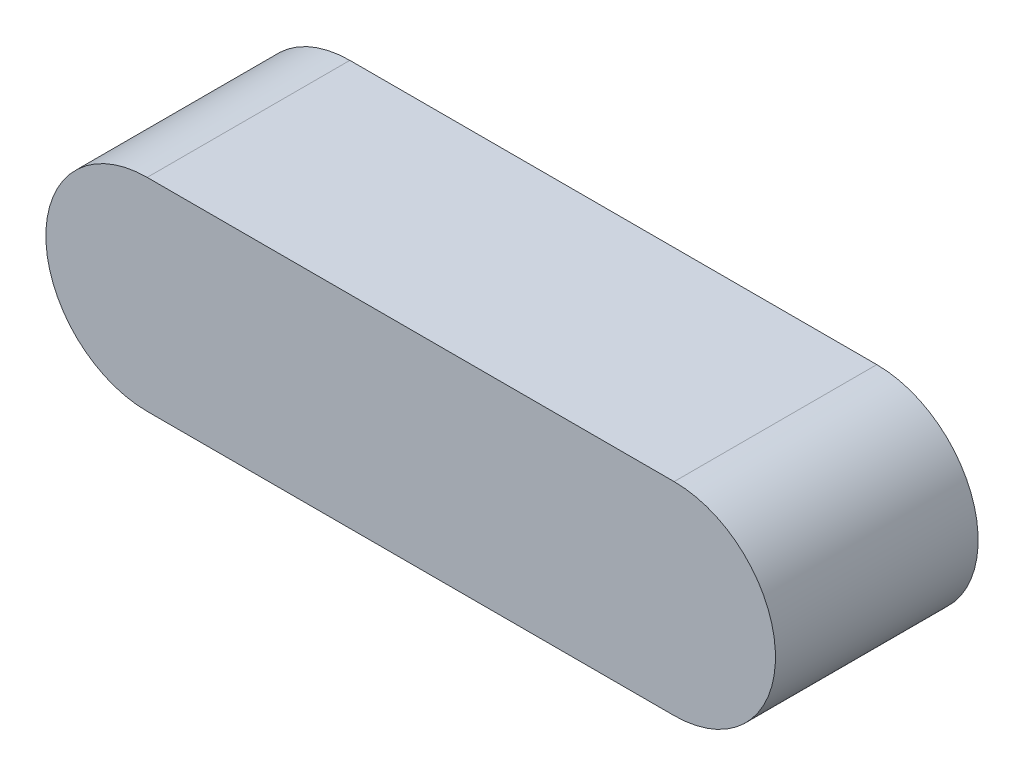
ISO-10303-21;
HEADER;
FILE_DESCRIPTION(('STEP AP214'),'2;1');
FILE_NAME('part.step','',(''),(''),'','','');
FILE_SCHEMA(('AUTOMOTIVE_DESIGN { 1 0 10303 214 1 1 1 1 }'));
ENDSEC;
DATA;
#1=APPLICATION_CONTEXT('core data for automotive mechanical design processes');
#2=APPLICATION_PROTOCOL_DEFINITION('international standard','automotive_design',2000,#1);
#3=PRODUCT_CONTEXT('',#1,'mechanical');
#4=PRODUCT('Part','Part','',(#3));
#5=PRODUCT_RELATED_PRODUCT_CATEGORY('part','',(#4));
#6=PRODUCT_DEFINITION_FORMATION('','',#4);
#7=PRODUCT_DEFINITION_CONTEXT('part definition',#1,'design');
#8=PRODUCT_DEFINITION('design','',#6,#7);
#9=PRODUCT_DEFINITION_SHAPE('','',#8);
#10=(LENGTH_UNIT() NAMED_UNIT(*) SI_UNIT(.MILLI.,.METRE.));
#11=(NAMED_UNIT(*) PLANE_ANGLE_UNIT() SI_UNIT($,.RADIAN.));
#12=(NAMED_UNIT(*) SI_UNIT($,.STERADIAN.) SOLID_ANGLE_UNIT());
#13=UNCERTAINTY_MEASURE_WITH_UNIT(LENGTH_MEASURE(1.E-05),#10,'distance_accuracy_value','');
#14=(GEOMETRIC_REPRESENTATION_CONTEXT(3) GLOBAL_UNCERTAINTY_ASSIGNED_CONTEXT((#13)) GLOBAL_UNIT_ASSIGNED_CONTEXT((#10,
#11,#12)) REPRESENTATION_CONTEXT('',''));
#15=CARTESIAN_POINT('',(0.,0.,0.));
#16=DIRECTION('',(0.,0.,1.));
#17=DIRECTION('',(1.,0.,0.));
#18=AXIS2_PLACEMENT_3D('',#15,#16,#17);
#19=CARTESIAN_POINT('',(0.,0.,25.));
#20=DIRECTION('',(0.,0.,-1.));
#21=DIRECTION('',(-1.,0.,0.));
#22=AXIS2_PLACEMENT_3D('',#19,#20,#21);
#23=CYLINDRICAL_SURFACE('',#22,12.5);
#24=CARTESIAN_POINT('',(0.,0.,0.));
#25=DIRECTION('',(0.,0.,1.));
#26=DIRECTION('',(1.,0.,0.));
#27=AXIS2_PLACEMENT_3D('',#24,#25,#26);
#28=CIRCLE('',#27,12.5);
#29=CARTESIAN_POINT('',(0.,12.5,0.));
#30=VERTEX_POINT('',#29);
#31=CARTESIAN_POINT('',(0.,-12.5,0.));
#32=VERTEX_POINT('',#31);
#33=EDGE_CURVE('E107',#30,#32,#28,.T.);
#34=ORIENTED_EDGE('',*,*,#33,.T.);
#35=DIRECTION('',(0.,0.,-1.));
#36=VECTOR('',#35,1.);
#37=CARTESIAN_POINT('',(0.,-12.5,25.));
#38=LINE('',#37,#36);
#39=CARTESIAN_POINT('',(0.,-12.5,25.));
#40=VERTEX_POINT('',#39);
#41=EDGE_CURVE('E11',#40,#32,#38,.T.);
#42=ORIENTED_EDGE('',*,*,#41,.F.);
#43=CARTESIAN_POINT('',(0.,0.,25.));
#44=DIRECTION('',(0.,0.,1.));
#45=DIRECTION('',(1.,0.,0.));
#46=AXIS2_PLACEMENT_3D('',#43,#44,#45);
#47=CIRCLE('',#46,12.5);
#48=CARTESIAN_POINT('',(0.,12.5,25.));
#49=VERTEX_POINT('',#48);
#50=EDGE_CURVE('E91',#49,#40,#47,.T.);
#51=ORIENTED_EDGE('',*,*,#50,.F.);
#52=DIRECTION('',(0.,0.,-1.));
#53=VECTOR('',#52,1.);
#54=CARTESIAN_POINT('',(0.,12.5,25.));
#55=LINE('',#54,#53);
#56=EDGE_CURVE('E103',#49,#30,#55,.T.);
#57=ORIENTED_EDGE('',*,*,#56,.T.);
#58=EDGE_LOOP('',(#34,#42,#51,#57));
#59=FACE_BOUND('',#58,.T.);
#60=ADVANCED_FACE('F39',(#59),#23,.T.);
#61=CARTESIAN_POINT('',(0.,-12.5,25.));
#62=DIRECTION('',(0.,1.,0.));
#63=DIRECTION('',(0.,0.,1.));
#64=AXIS2_PLACEMENT_3D('',#61,#62,#63);
#65=PLANE('',#64);
#66=DIRECTION('',(1.,0.,0.));
#67=VECTOR('',#66,1.);
#68=CARTESIAN_POINT('',(0.,-12.5,0.));
#69=LINE('',#68,#67);
#70=CARTESIAN_POINT('',(65.,-12.5,0.));
#71=VERTEX_POINT('',#70);
#72=EDGE_CURVE('E96',#32,#71,#69,.T.);
#73=ORIENTED_EDGE('',*,*,#72,.T.);
#74=DIRECTION('',(0.,0.,-1.));
#75=VECTOR('',#74,1.);
#76=CARTESIAN_POINT('',(65.,-12.5,25.));
#77=LINE('',#76,#75);
#78=CARTESIAN_POINT('',(65.,-12.5,25.));
#79=VERTEX_POINT('',#78);
#80=EDGE_CURVE('E48',#79,#71,#77,.T.);
#81=ORIENTED_EDGE('',*,*,#80,.F.);
#82=DIRECTION('',(1.,0.,0.));
#83=VECTOR('',#82,1.);
#84=CARTESIAN_POINT('',(0.,-12.5,25.));
#85=LINE('',#84,#83);
#86=EDGE_CURVE('E86',#40,#79,#85,.T.);
#87=ORIENTED_EDGE('',*,*,#86,.F.);
#88=ORIENTED_EDGE('',*,*,#41,.T.);
#89=EDGE_LOOP('',(#73,#81,#87,#88));
#90=FACE_BOUND('',#89,.T.);
#91=ADVANCED_FACE('F95',(#90),#65,.F.);
#92=CARTESIAN_POINT('',(65.,0.,25.));
#93=DIRECTION('',(0.,0.,-1.));
#94=DIRECTION('',(-1.,0.,0.));
#95=AXIS2_PLACEMENT_3D('',#92,#93,#94);
#96=CYLINDRICAL_SURFACE('',#95,12.5);
#97=CARTESIAN_POINT('',(65.,0.,0.));
#98=DIRECTION('',(0.,0.,1.));
#99=DIRECTION('',(1.,0.,0.));
#100=AXIS2_PLACEMENT_3D('',#97,#98,#99);
#101=CIRCLE('',#100,12.5);
#102=CARTESIAN_POINT('',(65.,12.5,0.));
#103=VERTEX_POINT('',#102);
#104=EDGE_CURVE('E73',#71,#103,#101,.T.);
#105=ORIENTED_EDGE('',*,*,#104,.T.);
#106=DIRECTION('',(0.,0.,-1.));
#107=VECTOR('',#106,1.);
#108=CARTESIAN_POINT('',(65.,12.5,25.));
#109=LINE('',#108,#107);
#110=CARTESIAN_POINT('',(65.,12.5,25.));
#111=VERTEX_POINT('',#110);
#112=EDGE_CURVE('E98',#111,#103,#109,.T.);
#113=ORIENTED_EDGE('',*,*,#112,.F.);
#114=CARTESIAN_POINT('',(65.,0.,25.));
#115=DIRECTION('',(0.,0.,1.));
#116=DIRECTION('',(1.,0.,0.));
#117=AXIS2_PLACEMENT_3D('',#114,#115,#116);
#118=CIRCLE('',#117,12.5);
#119=EDGE_CURVE('E89',#79,#111,#118,.T.);
#120=ORIENTED_EDGE('',*,*,#119,.F.);
#121=ORIENTED_EDGE('',*,*,#80,.T.);
#122=EDGE_LOOP('',(#105,#113,#120,#121));
#123=FACE_BOUND('',#122,.T.);
#124=ADVANCED_FACE('F99',(#123),#96,.T.);
#125=CARTESIAN_POINT('',(0.,12.5,25.));
#126=DIRECTION('',(0.,-1.,0.));
#127=DIRECTION('',(0.,0.,-1.));
#128=AXIS2_PLACEMENT_3D('',#125,#126,#127);
#129=PLANE('',#128);
#130=DIRECTION('',(-1.,0.,0.));
#131=VECTOR('',#130,1.);
#132=CARTESIAN_POINT('',(0.,12.5,0.));
#133=LINE('',#132,#131);
#134=EDGE_CURVE('E79',#103,#30,#133,.T.);
#135=ORIENTED_EDGE('',*,*,#134,.T.);
#136=ORIENTED_EDGE('',*,*,#56,.F.);
#137=DIRECTION('',(-1.,0.,0.));
#138=VECTOR('',#137,1.);
#139=CARTESIAN_POINT('',(0.,12.5,25.));
#140=LINE('',#139,#138);
#141=EDGE_CURVE('E56',#111,#49,#140,.T.);
#142=ORIENTED_EDGE('',*,*,#141,.F.);
#143=ORIENTED_EDGE('',*,*,#112,.T.);
#144=EDGE_LOOP('',(#135,#136,#142,#143));
#145=FACE_BOUND('',#144,.T.);
#146=ADVANCED_FACE('F121',(#145),#129,.F.);
#147=CARTESIAN_POINT('',(0.,0.,25.));
#148=DIRECTION('',(0.,0.,1.));
#149=DIRECTION('',(1.,0.,0.));
#150=AXIS2_PLACEMENT_3D('',#147,#148,#149);
#151=PLANE('',#150);
#152=ORIENTED_EDGE('',*,*,#50,.T.);
#153=ORIENTED_EDGE('',*,*,#86,.T.);
#154=ORIENTED_EDGE('',*,*,#119,.T.);
#155=ORIENTED_EDGE('',*,*,#141,.T.);
#156=EDGE_LOOP('',(#152,#153,#154,#155));
#157=FACE_BOUND('',#156,.T.);
#158=ADVANCED_FACE('F87',(#157),#151,.T.);
#159=CARTESIAN_POINT('',(0.,0.,0.));
#160=DIRECTION('',(0.,0.,1.));
#161=DIRECTION('',(1.,0.,0.));
#162=AXIS2_PLACEMENT_3D('',#159,#160,#161);
#163=PLANE('',#162);
#164=CARTESIAN_POINT('',(9.75,0.,0.));
#165=DIRECTION('',(0.,0.,-1.));
#166=DIRECTION('',(-1.,0.,0.));
#167=AXIS2_PLACEMENT_3D('',#164,#165,#166);
#168=CIRCLE('',#167,1.5);
#169=CARTESIAN_POINT('',(8.25,0.,0.));
#170=VERTEX_POINT('',#169);
#171=EDGE_CURVE('E136',#170,#170,#168,.T.);
#172=ORIENTED_EDGE('',*,*,#171,.F.);
#173=EDGE_LOOP('',(#172));
#174=FACE_BOUND('',#173,.T.);
#175=CARTESIAN_POINT('',(55.25,0.,0.));
#176=DIRECTION('',(0.,0.,-1.));
#177=DIRECTION('',(1.,0.,0.));
#178=AXIS2_PLACEMENT_3D('',#175,#176,#177);
#179=CIRCLE('',#178,1.5);
#180=CARTESIAN_POINT('',(56.75,0.,0.));
#181=VERTEX_POINT('',#180);
#182=EDGE_CURVE('E128',#181,#181,#179,.T.);
#183=ORIENTED_EDGE('',*,*,#182,.F.);
#184=EDGE_LOOP('',(#183));
#185=FACE_BOUND('',#184,.T.);
#186=ORIENTED_EDGE('',*,*,#33,.F.);
#187=ORIENTED_EDGE('',*,*,#134,.F.);
#188=ORIENTED_EDGE('',*,*,#104,.F.);
#189=ORIENTED_EDGE('',*,*,#72,.F.);
#190=EDGE_LOOP('',(#186,#187,#188,#189));
#191=FACE_BOUND('',#190,.T.);
#192=ADVANCED_FACE('F124',(#174,#185,#191),#163,.F.);
#193=CARTESIAN_POINT('',(55.25,0.,5.));
#194=DIRECTION('',(0.,0.,-1.));
#195=DIRECTION('',(-1.,0.,0.));
#196=AXIS2_PLACEMENT_3D('',#193,#194,#195);
#197=CYLINDRICAL_SURFACE('',#196,1.5);
#198=CARTESIAN_POINT('',(55.25,0.,5.));
#199=DIRECTION('',(0.,0.,-1.));
#200=DIRECTION('',(1.,0.,0.));
#201=AXIS2_PLACEMENT_3D('',#198,#199,#200);
#202=CIRCLE('',#201,1.5);
#203=CARTESIAN_POINT('',(56.75,0.,5.));
#204=VERTEX_POINT('',#203);
#205=EDGE_CURVE('E132',#204,#204,#202,.T.);
#206=ORIENTED_EDGE('',*,*,#205,.F.);
#207=EDGE_LOOP('',(#206));
#208=FACE_BOUND('',#207,.T.);
#209=ORIENTED_EDGE('',*,*,#182,.T.);
#210=EDGE_LOOP('',(#209));
#211=FACE_BOUND('',#210,.T.);
#212=ADVANCED_FACE('F155',(#208,#211),#197,.F.);
#213=CARTESIAN_POINT('',(55.25,0.,5.));
#214=DIRECTION('',(0.,0.,1.));
#215=DIRECTION('',(1.,0.,0.));
#216=AXIS2_PLACEMENT_3D('',#213,#214,#215);
#217=PLANE('',#216);
#218=ORIENTED_EDGE('',*,*,#205,.T.);
#219=EDGE_LOOP('',(#218));
#220=FACE_BOUND('',#219,.T.);
#221=ADVANCED_FACE('F149',(#220),#217,.F.);
#222=CARTESIAN_POINT('',(9.75,0.,5.));
#223=DIRECTION('',(0.,0.,-1.));
#224=DIRECTION('',(-1.,0.,0.));
#225=AXIS2_PLACEMENT_3D('',#222,#223,#224);
#226=CYLINDRICAL_SURFACE('',#225,1.5);
#227=CARTESIAN_POINT('',(9.75,0.,5.));
#228=DIRECTION('',(0.,0.,-1.));
#229=DIRECTION('',(-1.,0.,0.));
#230=AXIS2_PLACEMENT_3D('',#227,#228,#229);
#231=CIRCLE('',#230,1.5);
#232=CARTESIAN_POINT('',(8.25,0.,5.));
#233=VERTEX_POINT('',#232);
#234=EDGE_CURVE('E111',#233,#233,#231,.T.);
#235=ORIENTED_EDGE('',*,*,#234,.F.);
#236=EDGE_LOOP('',(#235));
#237=FACE_BOUND('',#236,.T.);
#238=ORIENTED_EDGE('',*,*,#171,.T.);
#239=EDGE_LOOP('',(#238));
#240=FACE_BOUND('',#239,.T.);
#241=ADVANCED_FACE('F146',(#237,#240),#226,.F.);
#242=CARTESIAN_POINT('',(9.75,0.,5.));
#243=DIRECTION('',(0.,0.,-1.));
#244=DIRECTION('',(-1.,0.,0.));
#245=AXIS2_PLACEMENT_3D('',#242,#243,#244);
#246=PLANE('',#245);
#247=ORIENTED_EDGE('',*,*,#234,.T.);
#248=EDGE_LOOP('',(#247));
#249=FACE_BOUND('',#248,.T.);
#250=ADVANCED_FACE('F144',(#249),#246,.T.);
#251=CLOSED_SHELL('',(#60,#91,#124,#146,#158,#192,#212,#221,#241,#250));
#252=MANIFOLD_SOLID_BREP('B2',#251);
#253=ADVANCED_BREP_SHAPE_REPRESENTATION('',(#18,#252),#14);
#254=SHAPE_DEFINITION_REPRESENTATION(#9,#253);
ENDSEC;
END-ISO-10303-21;
